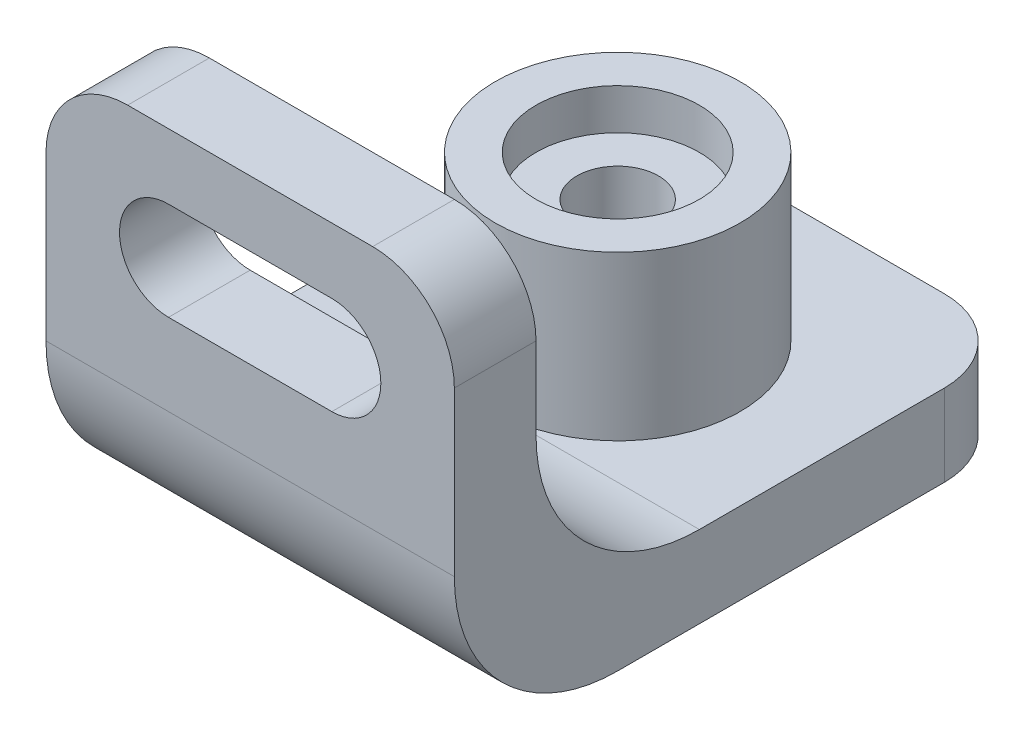
ISO-10303-21;
HEADER;
FILE_DESCRIPTION(('STEP AP214'),'2;1');
FILE_NAME('part.step','',(''),(''),'','','');
FILE_SCHEMA(('AUTOMOTIVE_DESIGN { 1 0 10303 214 1 1 1 1 }'));
ENDSEC;
DATA;
#1=APPLICATION_CONTEXT('core data for automotive mechanical design processes');
#2=APPLICATION_PROTOCOL_DEFINITION('international standard','automotive_design',2000,#1);
#3=PRODUCT_CONTEXT('',#1,'mechanical');
#4=PRODUCT('Part','Part','',(#3));
#5=PRODUCT_RELATED_PRODUCT_CATEGORY('part','',(#4));
#6=PRODUCT_DEFINITION_FORMATION('','',#4);
#7=PRODUCT_DEFINITION_CONTEXT('part definition',#1,'design');
#8=PRODUCT_DEFINITION('design','',#6,#7);
#9=PRODUCT_DEFINITION_SHAPE('','',#8);
#10=(LENGTH_UNIT() NAMED_UNIT(*) SI_UNIT(.MILLI.,.METRE.));
#11=(NAMED_UNIT(*) PLANE_ANGLE_UNIT() SI_UNIT($,.RADIAN.));
#12=(NAMED_UNIT(*) SI_UNIT($,.STERADIAN.) SOLID_ANGLE_UNIT());
#13=UNCERTAINTY_MEASURE_WITH_UNIT(LENGTH_MEASURE(1.E-05),#10,'distance_accuracy_value','');
#14=(GEOMETRIC_REPRESENTATION_CONTEXT(3) GLOBAL_UNCERTAINTY_ASSIGNED_CONTEXT((#13)) GLOBAL_UNIT_ASSIGNED_CONTEXT((#10,
#11,#12)) REPRESENTATION_CONTEXT('',''));
#15=CARTESIAN_POINT('',(0.,0.,0.));
#16=DIRECTION('',(0.,0.,1.));
#17=DIRECTION('',(1.,0.,0.));
#18=AXIS2_PLACEMENT_3D('',#15,#16,#17);
#19=CARTESIAN_POINT('',(50.,31.6267942583732,33.6842105263158));
#20=DIRECTION('',(0.,-1.,0.));
#21=DIRECTION('',(0.,0.,-1.));
#22=AXIS2_PLACEMENT_3D('',#19,#20,#21);
#23=PLANE('',#22);
#24=DIRECTION('',(-1.,0.,0.));
#25=VECTOR('',#24,1.);
#26=CARTESIAN_POINT('',(50.,31.6267942583732,23.6842105263158));
#27=LINE('',#26,#25);
#28=CARTESIAN_POINT('',(40.,31.6267942583732,23.6842105263158));
#29=VERTEX_POINT('',#28);
#30=CARTESIAN_POINT('',(10.,31.6267942583732,23.6842105263158));
#31=VERTEX_POINT('',#30);
#32=EDGE_CURVE('E281',#29,#31,#27,.T.);
#33=ORIENTED_EDGE('',*,*,#32,.T.);
#34=DIRECTION('',(0.,0.,1.));
#35=VECTOR('',#34,1.);
#36=CARTESIAN_POINT('',(10.,31.6267942583732,33.6842105263158));
#37=LINE('',#36,#35);
#38=CARTESIAN_POINT('',(10.,31.6267942583732,33.6842105263158));
#39=VERTEX_POINT('',#38);
#40=EDGE_CURVE('E212',#31,#39,#37,.T.);
#41=ORIENTED_EDGE('',*,*,#40,.T.);
#42=DIRECTION('',(-1.,0.,0.));
#43=VECTOR('',#42,1.);
#44=CARTESIAN_POINT('',(50.,31.6267942583732,33.6842105263158));
#45=LINE('',#44,#43);
#46=CARTESIAN_POINT('',(40.,31.6267942583732,33.6842105263158));
#47=VERTEX_POINT('',#46);
#48=EDGE_CURVE('E195',#47,#39,#45,.T.);
#49=ORIENTED_EDGE('',*,*,#48,.F.);
#50=DIRECTION('',(0.,0.,1.));
#51=VECTOR('',#50,1.);
#52=CARTESIAN_POINT('',(40.,31.6267942583732,33.6842105263158));
#53=LINE('',#52,#51);
#54=EDGE_CURVE('E206',#47,#29,#53,.F.);
#55=ORIENTED_EDGE('',*,*,#54,.T.);
#56=EDGE_LOOP('',(#33,#41,#49,#55));
#57=FACE_BOUND('',#56,.T.);
#58=ADVANCED_FACE('F39',(#57),#23,.F.);
#59=CARTESIAN_POINT('',(50.,31.6267942583732,33.6842105263158));
#60=DIRECTION('',(0.,0.,-1.));
#61=DIRECTION('',(-1.,0.,0.));
#62=AXIS2_PLACEMENT_3D('',#59,#60,#61);
#63=PLANE('',#62);
#64=DIRECTION('',(-1.,0.,0.));
#65=VECTOR('',#64,1.);
#66=CARTESIAN_POINT('',(35.,11.6267942583732,33.6842105263158));
#67=LINE('',#66,#65);
#68=CARTESIAN_POINT('',(35.,11.6267942583732,33.6842105263158));
#69=VERTEX_POINT('',#68);
#70=CARTESIAN_POINT('',(15.,11.6267942583732,33.6842105263158));
#71=VERTEX_POINT('',#70);
#72=EDGE_CURVE('E339',#69,#71,#67,.T.);
#73=ORIENTED_EDGE('',*,*,#72,.T.);
#74=CARTESIAN_POINT('',(15.,17.6267942583732,33.6842105263158));
#75=DIRECTION('',(0.,0.,-1.));
#76=DIRECTION('',(0.,1.,0.));
#77=AXIS2_PLACEMENT_3D('',#74,#75,#76);
#78=CIRCLE('',#77,6.);
#79=CARTESIAN_POINT('',(15.,23.6267942583732,33.6842105263158));
#80=VERTEX_POINT('',#79);
#81=EDGE_CURVE('E351',#71,#80,#78,.T.);
#82=ORIENTED_EDGE('',*,*,#81,.T.);
#83=DIRECTION('',(1.,0.,0.));
#84=VECTOR('',#83,1.);
#85=CARTESIAN_POINT('',(35.,23.6267942583732,33.6842105263158));
#86=LINE('',#85,#84);
#87=CARTESIAN_POINT('',(35.,23.6267942583732,33.6842105263158));
#88=VERTEX_POINT('',#87);
#89=EDGE_CURVE('E370',#80,#88,#86,.T.);
#90=ORIENTED_EDGE('',*,*,#89,.T.);
#91=CARTESIAN_POINT('',(35.,17.6267942583732,33.6842105263158));
#92=DIRECTION('',(0.,0.,-1.));
#93=DIRECTION('',(0.,1.,0.));
#94=AXIS2_PLACEMENT_3D('',#91,#92,#93);
#95=CIRCLE('',#94,6.);
#96=EDGE_CURVE('E366',#88,#69,#95,.T.);
#97=ORIENTED_EDGE('',*,*,#96,.T.);
#98=EDGE_LOOP('',(#73,#82,#90,#97));
#99=FACE_BOUND('',#98,.T.);
#100=ORIENTED_EDGE('',*,*,#48,.T.);
#101=CARTESIAN_POINT('',(10.,21.6267942583732,33.6842105263158));
#102=DIRECTION('',(0.,0.,-1.));
#103=DIRECTION('',(-1.,0.,0.));
#104=AXIS2_PLACEMENT_3D('',#101,#102,#103);
#105=CIRCLE('',#104,10.);
#106=CARTESIAN_POINT('',(0.,21.6267942583732,33.6842105263158));
#107=VERTEX_POINT('',#106);
#108=EDGE_CURVE('E216',#39,#107,#105,.F.);
#109=ORIENTED_EDGE('',*,*,#108,.T.);
#110=DIRECTION('',(0.,-1.,0.));
#111=VECTOR('',#110,1.);
#112=CARTESIAN_POINT('',(0.,31.6267942583732,33.6842105263158));
#113=LINE('',#112,#111);
#114=CARTESIAN_POINT('',(0.,1.62679425837335,33.6842105263158));
#115=VERTEX_POINT('',#114);
#116=EDGE_CURVE('E282',#107,#115,#113,.T.);
#117=ORIENTED_EDGE('',*,*,#116,.T.);
#118=DIRECTION('',(-1.,0.,0.));
#119=VECTOR('',#118,1.);
#120=CARTESIAN_POINT('',(50.,1.62679425837335,33.6842105263158));
#121=LINE('',#120,#119);
#122=CARTESIAN_POINT('',(50.,1.62679425837335,33.6842105263158));
#123=VERTEX_POINT('',#122);
#124=EDGE_CURVE('E191',#123,#115,#121,.T.);
#125=ORIENTED_EDGE('',*,*,#124,.F.);
#126=DIRECTION('',(0.,-1.,0.));
#127=VECTOR('',#126,1.);
#128=CARTESIAN_POINT('',(50.,31.6267942583732,33.6842105263158));
#129=LINE('',#128,#127);
#130=CARTESIAN_POINT('',(50.,21.6267942583732,33.6842105263158));
#131=VERTEX_POINT('',#130);
#132=EDGE_CURVE('E271',#131,#123,#129,.T.);
#133=ORIENTED_EDGE('',*,*,#132,.F.);
#134=CARTESIAN_POINT('',(40.,21.6267942583732,33.6842105263158));
#135=DIRECTION('',(0.,0.,-1.));
#136=DIRECTION('',(-1.,0.,0.));
#137=AXIS2_PLACEMENT_3D('',#134,#135,#136);
#138=CIRCLE('',#137,10.);
#139=EDGE_CURVE('E203',#131,#47,#138,.F.);
#140=ORIENTED_EDGE('',*,*,#139,.T.);
#141=EDGE_LOOP('',(#100,#109,#117,#125,#133,#140));
#142=FACE_BOUND('',#141,.T.);
#143=ADVANCED_FACE('F330',(#99,#142),#63,.F.);
#144=CARTESIAN_POINT('',(50.,1.6267942583732,13.6842105263158));
#145=DIRECTION('',(-1.,0.,0.));
#146=DIRECTION('',(0.,0.,1.));
#147=AXIS2_PLACEMENT_3D('',#144,#145,#146);
#148=CYLINDRICAL_SURFACE('',#147,20.);
#149=CARTESIAN_POINT('',(0.,1.6267942583732,13.6842105263158));
#150=DIRECTION('',(1.,0.,0.));
#151=DIRECTION('',(0.,0.,1.));
#152=AXIS2_PLACEMENT_3D('',#149,#150,#151);
#153=CIRCLE('',#152,20.);
#154=CARTESIAN_POINT('',(0.,-18.3732057416268,13.6842105263157));
#155=VERTEX_POINT('',#154);
#156=EDGE_CURVE('E285',#115,#155,#153,.T.);
#157=ORIENTED_EDGE('',*,*,#156,.T.);
#158=DIRECTION('',(-1.,0.,0.));
#159=VECTOR('',#158,1.);
#160=CARTESIAN_POINT('',(50.,-18.3732057416268,13.6842105263157));
#161=LINE('',#160,#159);
#162=CARTESIAN_POINT('',(50.,-18.3732057416268,13.6842105263157));
#163=VERTEX_POINT('',#162);
#164=EDGE_CURVE('E187',#163,#155,#161,.T.);
#165=ORIENTED_EDGE('',*,*,#164,.F.);
#166=CARTESIAN_POINT('',(50.,1.6267942583732,13.6842105263158));
#167=DIRECTION('',(1.,0.,0.));
#168=DIRECTION('',(0.,0.,1.));
#169=AXIS2_PLACEMENT_3D('',#166,#167,#168);
#170=CIRCLE('',#169,20.);
#171=EDGE_CURVE('E263',#123,#163,#170,.T.);
#172=ORIENTED_EDGE('',*,*,#171,.F.);
#173=ORIENTED_EDGE('',*,*,#124,.T.);
#174=EDGE_LOOP('',(#157,#165,#172,#173));
#175=FACE_BOUND('',#174,.T.);
#176=ADVANCED_FACE('F438',(#175),#148,.T.);
#177=CARTESIAN_POINT('',(50.,-18.3732057416268,13.6842105263157));
#178=DIRECTION('',(0.,1.,0.));
#179=DIRECTION('',(0.,0.,1.));
#180=AXIS2_PLACEMENT_3D('',#177,#178,#179);
#181=PLANE('',#180);
#182=DIRECTION('',(0.,0.,-1.));
#183=VECTOR('',#182,1.);
#184=CARTESIAN_POINT('',(0.,-18.3732057416268,13.6842105263157));
#185=LINE('',#184,#183);
#186=CARTESIAN_POINT('',(0.,-18.3732057416268,-26.3157894736842));
#187=VERTEX_POINT('',#186);
#188=EDGE_CURVE('E289',#155,#187,#185,.T.);
#189=ORIENTED_EDGE('',*,*,#188,.T.);
#190=CARTESIAN_POINT('',(10.,-18.3732057416268,-26.3157894736842));
#191=DIRECTION('',(0.,1.,0.));
#192=DIRECTION('',(0.,0.,1.));
#193=AXIS2_PLACEMENT_3D('',#190,#191,#192);
#194=CIRCLE('',#193,10.);
#195=CARTESIAN_POINT('',(10.,-18.3732057416268,-36.3157894736842));
#196=VERTEX_POINT('',#195);
#197=EDGE_CURVE('E11',#187,#196,#194,.F.);
#198=ORIENTED_EDGE('',*,*,#197,.T.);
#199=DIRECTION('',(-1.,0.,0.));
#200=VECTOR('',#199,1.);
#201=CARTESIAN_POINT('',(50.,-18.3732057416268,-36.3157894736842));
#202=LINE('',#201,#200);
#203=CARTESIAN_POINT('',(40.,-18.3732057416268,-36.3157894736842));
#204=VERTEX_POINT('',#203);
#205=EDGE_CURVE('E183',#204,#196,#202,.T.);
#206=ORIENTED_EDGE('',*,*,#205,.F.);
#207=CARTESIAN_POINT('',(40.,-18.3732057416268,-26.3157894736842));
#208=DIRECTION('',(0.,1.,0.));
#209=DIRECTION('',(0.,0.,1.));
#210=AXIS2_PLACEMENT_3D('',#207,#208,#209);
#211=CIRCLE('',#210,10.);
#212=CARTESIAN_POINT('',(50.,-18.3732057416268,-26.3157894736842));
#213=VERTEX_POINT('',#212);
#214=EDGE_CURVE('E235',#204,#213,#211,.F.);
#215=ORIENTED_EDGE('',*,*,#214,.T.);
#216=DIRECTION('',(0.,0.,-1.));
#217=VECTOR('',#216,1.);
#218=CARTESIAN_POINT('',(50.,-18.3732057416268,13.6842105263157));
#219=LINE('',#218,#217);
#220=EDGE_CURVE('E261',#163,#213,#219,.T.);
#221=ORIENTED_EDGE('',*,*,#220,.F.);
#222=ORIENTED_EDGE('',*,*,#164,.T.);
#223=EDGE_LOOP('',(#189,#198,#206,#215,#221,#222));
#224=FACE_BOUND('',#223,.T.);
#225=ADVANCED_FACE('F586',(#224),#181,.F.);
#226=CARTESIAN_POINT('',(50.,-8.3732057416268,-36.3157894736842));
#227=DIRECTION('',(0.,0.,1.));
#228=DIRECTION('',(1.,0.,0.));
#229=AXIS2_PLACEMENT_3D('',#226,#227,#228);
#230=PLANE('',#229);
#231=ORIENTED_EDGE('',*,*,#205,.T.);
#232=DIRECTION('',(0.,1.,0.));
#233=VECTOR('',#232,1.);
#234=CARTESIAN_POINT('',(10.,-8.3732057416268,-36.3157894736842));
#235=LINE('',#234,#233);
#236=CARTESIAN_POINT('',(10.,-8.3732057416268,-36.3157894736842));
#237=VERTEX_POINT('',#236);
#238=EDGE_CURVE('E238',#196,#237,#235,.T.);
#239=ORIENTED_EDGE('',*,*,#238,.T.);
#240=DIRECTION('',(-1.,0.,0.));
#241=VECTOR('',#240,1.);
#242=CARTESIAN_POINT('',(50.,-8.3732057416268,-36.3157894736842));
#243=LINE('',#242,#241);
#244=CARTESIAN_POINT('',(40.,-8.3732057416268,-36.3157894736842));
#245=VERTEX_POINT('',#244);
#246=EDGE_CURVE('E166',#245,#237,#243,.T.);
#247=ORIENTED_EDGE('',*,*,#246,.F.);
#248=DIRECTION('',(0.,1.,0.));
#249=VECTOR('',#248,1.);
#250=CARTESIAN_POINT('',(40.,-8.3732057416268,-36.3157894736842));
#251=LINE('',#250,#249);
#252=EDGE_CURVE('E232',#245,#204,#251,.F.);
#253=ORIENTED_EDGE('',*,*,#252,.T.);
#254=EDGE_LOOP('',(#231,#239,#247,#253));
#255=FACE_BOUND('',#254,.T.);
#256=ADVANCED_FACE('F247',(#255),#230,.F.);
#257=CARTESIAN_POINT('',(50.,-8.3732057416268,3.68421052631565));
#258=DIRECTION('',(0.,-1.,0.));
#259=DIRECTION('',(0.,0.,-1.));
#260=AXIS2_PLACEMENT_3D('',#257,#258,#259);
#261=PLANE('',#260);
#262=DIRECTION('',(-1.,0.,0.));
#263=VECTOR('',#262,1.);
#264=CARTESIAN_POINT('',(50.,-8.3732057416268,3.68421052631565));
#265=LINE('',#264,#263);
#266=CARTESIAN_POINT('',(25.,-8.3732057416268,3.68421052631579));
#267=VERTEX_POINT('',#266);
#268=CARTESIAN_POINT('',(0.,-8.3732057416268,3.68421052631565));
#269=VERTEX_POINT('',#268);
#270=EDGE_CURVE('E160',#267,#269,#265,.T.);
#271=ORIENTED_EDGE('',*,*,#270,.F.);
#272=CARTESIAN_POINT('',(25.,-8.3732057416268,-11.3157894736842));
#273=DIRECTION('',(0.,1.,0.));
#274=DIRECTION('',(0.,0.,1.));
#275=AXIS2_PLACEMENT_3D('',#272,#273,#274);
#276=CIRCLE('',#275,15.);
#277=EDGE_CURVE('E170',#267,#267,#276,.T.);
#278=ORIENTED_EDGE('',*,*,#277,.F.);
#279=CARTESIAN_POINT('',(50.,-8.3732057416268,3.68421052631565));
#280=VERTEX_POINT('',#279);
#281=EDGE_CURVE('E156',#280,#267,#265,.T.);
#282=ORIENTED_EDGE('',*,*,#281,.F.);
#283=DIRECTION('',(0.,0.,1.));
#284=VECTOR('',#283,1.);
#285=CARTESIAN_POINT('',(50.,-8.3732057416268,3.68421052631565));
#286=LINE('',#285,#284);
#287=CARTESIAN_POINT('',(50.,-8.3732057416268,-26.3157894736842));
#288=VERTEX_POINT('',#287);
#289=EDGE_CURVE('E252',#288,#280,#286,.T.);
#290=ORIENTED_EDGE('',*,*,#289,.F.);
#291=CARTESIAN_POINT('',(40.,-8.3732057416268,-26.3157894736842));
#292=DIRECTION('',(0.,-1.,0.));
#293=DIRECTION('',(0.,0.,-1.));
#294=AXIS2_PLACEMENT_3D('',#291,#292,#293);
#295=CIRCLE('',#294,10.);
#296=EDGE_CURVE('E229',#288,#245,#295,.F.);
#297=ORIENTED_EDGE('',*,*,#296,.T.);
#298=ORIENTED_EDGE('',*,*,#246,.T.);
#299=CARTESIAN_POINT('',(10.,-8.3732057416268,-26.3157894736842));
#300=DIRECTION('',(0.,-1.,0.));
#301=DIRECTION('',(0.,0.,-1.));
#302=AXIS2_PLACEMENT_3D('',#299,#300,#301);
#303=CIRCLE('',#302,10.);
#304=CARTESIAN_POINT('',(0.,-8.3732057416268,-26.3157894736842));
#305=VERTEX_POINT('',#304);
#306=EDGE_CURVE('E62',#237,#305,#303,.F.);
#307=ORIENTED_EDGE('',*,*,#306,.T.);
#308=DIRECTION('',(0.,0.,1.));
#309=VECTOR('',#308,1.);
#310=CARTESIAN_POINT('',(0.,-8.3732057416268,3.68421052631565));
#311=LINE('',#310,#309);
#312=EDGE_CURVE('E171',#305,#269,#311,.T.);
#313=ORIENTED_EDGE('',*,*,#312,.T.);
#314=EDGE_LOOP('',(#271,#278,#282,#290,#297,#298,#307,#313));
#315=FACE_BOUND('',#314,.T.);
#316=ADVANCED_FACE('F168',(#315),#261,.F.);
#317=CARTESIAN_POINT('',(50.,11.6267942583732,3.68421052631579));
#318=DIRECTION('',(-1.,0.,0.));
#319=DIRECTION('',(0.,0.,1.));
#320=AXIS2_PLACEMENT_3D('',#317,#318,#319);
#321=CYLINDRICAL_SURFACE('',#320,20.);
#322=CARTESIAN_POINT('',(0.,11.6267942583732,3.68421052631579));
#323=DIRECTION('',(-1.,0.,0.));
#324=DIRECTION('',(0.,0.,1.));
#325=AXIS2_PLACEMENT_3D('',#322,#323,#324);
#326=CIRCLE('',#325,20.);
#327=CARTESIAN_POINT('',(0.,11.6267942583732,23.6842105263158));
#328=VERTEX_POINT('',#327);
#329=EDGE_CURVE('E294',#269,#328,#326,.T.);
#330=ORIENTED_EDGE('',*,*,#329,.T.);
#331=DIRECTION('',(-1.,0.,0.));
#332=VECTOR('',#331,1.);
#333=CARTESIAN_POINT('',(50.,11.6267942583732,23.6842105263158));
#334=LINE('',#333,#332);
#335=CARTESIAN_POINT('',(15.,11.6267942583732,23.6842105263158));
#336=VERTEX_POINT('',#335);
#337=EDGE_CURVE('E177',#336,#328,#334,.T.);
#338=ORIENTED_EDGE('',*,*,#337,.F.);
#339=DIRECTION('',(-1.,0.,0.));
#340=VECTOR('',#339,1.);
#341=CARTESIAN_POINT('',(35.,11.6267942583732,23.6842105263158));
#342=LINE('',#341,#340);
#343=CARTESIAN_POINT('',(35.,11.6267942583732,23.6842105263158));
#344=VERTEX_POINT('',#343);
#345=EDGE_CURVE('E347',#344,#336,#342,.T.);
#346=ORIENTED_EDGE('',*,*,#345,.F.);
#347=CARTESIAN_POINT('',(50.,11.6267942583732,23.6842105263158));
#348=VERTEX_POINT('',#347);
#349=EDGE_CURVE('E174',#348,#344,#334,.T.);
#350=ORIENTED_EDGE('',*,*,#349,.F.);
#351=CARTESIAN_POINT('',(50.,11.6267942583732,3.68421052631579));
#352=DIRECTION('',(-1.,0.,0.));
#353=DIRECTION('',(0.,0.,1.));
#354=AXIS2_PLACEMENT_3D('',#351,#352,#353);
#355=CIRCLE('',#354,20.);
#356=EDGE_CURVE('E162',#280,#348,#355,.T.);
#357=ORIENTED_EDGE('',*,*,#356,.F.);
#358=ORIENTED_EDGE('',*,*,#281,.T.);
#359=ORIENTED_EDGE('',*,*,#270,.T.);
#360=EDGE_LOOP('',(#330,#338,#346,#350,#357,#358,#359));
#361=FACE_BOUND('',#360,.T.);
#362=ADVANCED_FACE('F159',(#361),#321,.F.);
#363=CARTESIAN_POINT('',(50.,31.6267942583732,23.6842105263158));
#364=DIRECTION('',(0.,0.,1.));
#365=DIRECTION('',(0.,-1.,0.));
#366=AXIS2_PLACEMENT_3D('',#363,#364,#365);
#367=PLANE('',#366);
#368=DIRECTION('',(0.,1.,0.));
#369=VECTOR('',#368,1.);
#370=CARTESIAN_POINT('',(0.,31.6267942583732,23.6842105263158));
#371=LINE('',#370,#369);
#372=CARTESIAN_POINT('',(0.,21.6267942583732,23.6842105263158));
#373=VERTEX_POINT('',#372);
#374=EDGE_CURVE('E297',#328,#373,#371,.T.);
#375=ORIENTED_EDGE('',*,*,#374,.T.);
#376=CARTESIAN_POINT('',(10.,21.6267942583732,23.6842105263158));
#377=DIRECTION('',(0.,0.,1.));
#378=DIRECTION('',(0.,-1.,0.));
#379=AXIS2_PLACEMENT_3D('',#376,#377,#378);
#380=CIRCLE('',#379,10.);
#381=EDGE_CURVE('E222',#373,#31,#380,.F.);
#382=ORIENTED_EDGE('',*,*,#381,.T.);
#383=ORIENTED_EDGE('',*,*,#32,.F.);
#384=CARTESIAN_POINT('',(40.,21.6267942583732,23.6842105263158));
#385=DIRECTION('',(0.,0.,1.));
#386=DIRECTION('',(0.,-1.,0.));
#387=AXIS2_PLACEMENT_3D('',#384,#385,#386);
#388=CIRCLE('',#387,10.);
#389=CARTESIAN_POINT('',(50.,21.6267942583732,23.6842105263158));
#390=VERTEX_POINT('',#389);
#391=EDGE_CURVE('E209',#29,#390,#388,.F.);
#392=ORIENTED_EDGE('',*,*,#391,.T.);
#393=DIRECTION('',(0.,1.,0.));
#394=VECTOR('',#393,1.);
#395=CARTESIAN_POINT('',(50.,31.6267942583732,23.6842105263158));
#396=LINE('',#395,#394);
#397=EDGE_CURVE('E277',#348,#390,#396,.T.);
#398=ORIENTED_EDGE('',*,*,#397,.F.);
#399=ORIENTED_EDGE('',*,*,#349,.T.);
#400=CARTESIAN_POINT('',(35.,17.6267942583732,23.6842105263158));
#401=DIRECTION('',(0.,0.,-1.));
#402=DIRECTION('',(0.,1.,0.));
#403=AXIS2_PLACEMENT_3D('',#400,#401,#402);
#404=CIRCLE('',#403,6.);
#405=CARTESIAN_POINT('',(35.,23.6267942583732,23.6842105263158));
#406=VERTEX_POINT('',#405);
#407=EDGE_CURVE('E352',#406,#344,#404,.T.);
#408=ORIENTED_EDGE('',*,*,#407,.F.);
#409=DIRECTION('',(1.,0.,0.));
#410=VECTOR('',#409,1.);
#411=CARTESIAN_POINT('',(35.,23.6267942583732,23.6842105263158));
#412=LINE('',#411,#410);
#413=CARTESIAN_POINT('',(15.,23.6267942583732,23.6842105263158));
#414=VERTEX_POINT('',#413);
#415=EDGE_CURVE('E356',#414,#406,#412,.T.);
#416=ORIENTED_EDGE('',*,*,#415,.F.);
#417=CARTESIAN_POINT('',(15.,17.6267942583732,23.6842105263158));
#418=DIRECTION('',(0.,0.,-1.));
#419=DIRECTION('',(0.,1.,0.));
#420=AXIS2_PLACEMENT_3D('',#417,#418,#419);
#421=CIRCLE('',#420,6.);
#422=EDGE_CURVE('E313',#336,#414,#421,.T.);
#423=ORIENTED_EDGE('',*,*,#422,.F.);
#424=ORIENTED_EDGE('',*,*,#337,.T.);
#425=EDGE_LOOP('',(#375,#382,#383,#392,#398,#399,#408,#416,#423,#424));
#426=FACE_BOUND('',#425,.T.);
#427=ADVANCED_FACE('F309',(#426),#367,.F.);
#428=CARTESIAN_POINT('',(50.,11.6267942583732,3.68421052631579));
#429=DIRECTION('',(-1.,0.,0.));
#430=DIRECTION('',(0.,0.,1.));
#431=AXIS2_PLACEMENT_3D('',#428,#429,#430);
#432=PLANE('',#431);
#433=ORIENTED_EDGE('',*,*,#220,.T.);
#434=DIRECTION('',(0.,1.,0.));
#435=VECTOR('',#434,1.);
#436=CARTESIAN_POINT('',(50.,11.6267942583732,-26.3157894736842));
#437=LINE('',#436,#435);
#438=EDGE_CURVE('E225',#213,#288,#437,.T.);
#439=ORIENTED_EDGE('',*,*,#438,.T.);
#440=ORIENTED_EDGE('',*,*,#289,.T.);
#441=ORIENTED_EDGE('',*,*,#356,.T.);
#442=ORIENTED_EDGE('',*,*,#397,.T.);
#443=DIRECTION('',(0.,0.,1.));
#444=VECTOR('',#443,1.);
#445=CARTESIAN_POINT('',(50.,21.6267942583732,3.68421052631579));
#446=LINE('',#445,#444);
#447=EDGE_CURVE('E199',#390,#131,#446,.T.);
#448=ORIENTED_EDGE('',*,*,#447,.T.);
#449=ORIENTED_EDGE('',*,*,#132,.T.);
#450=ORIENTED_EDGE('',*,*,#171,.T.);
#451=EDGE_LOOP('',(#433,#439,#440,#441,#442,#448,#449,#450));
#452=FACE_BOUND('',#451,.T.);
#453=ADVANCED_FACE('F259',(#452),#432,.F.);
#454=CARTESIAN_POINT('',(0.,11.6267942583732,3.68421052631579));
#455=DIRECTION('',(-1.,0.,0.));
#456=DIRECTION('',(0.,0.,1.));
#457=AXIS2_PLACEMENT_3D('',#454,#455,#456);
#458=PLANE('',#457);
#459=ORIENTED_EDGE('',*,*,#312,.F.);
#460=DIRECTION('',(0.,1.,0.));
#461=VECTOR('',#460,1.);
#462=CARTESIAN_POINT('',(0.,-18.3732057416268,-26.3157894736842));
#463=LINE('',#462,#461);
#464=EDGE_CURVE('E48',#305,#187,#463,.F.);
#465=ORIENTED_EDGE('',*,*,#464,.T.);
#466=ORIENTED_EDGE('',*,*,#188,.F.);
#467=ORIENTED_EDGE('',*,*,#156,.F.);
#468=ORIENTED_EDGE('',*,*,#116,.F.);
#469=DIRECTION('',(0.,0.,1.));
#470=VECTOR('',#469,1.);
#471=CARTESIAN_POINT('',(0.,21.6267942583732,23.6842105263158));
#472=LINE('',#471,#470);
#473=EDGE_CURVE('E219',#107,#373,#472,.F.);
#474=ORIENTED_EDGE('',*,*,#473,.T.);
#475=ORIENTED_EDGE('',*,*,#374,.F.);
#476=ORIENTED_EDGE('',*,*,#329,.F.);
#477=EDGE_LOOP('',(#459,#465,#466,#467,#468,#474,#475,#476));
#478=FACE_BOUND('',#477,.T.);
#479=ADVANCED_FACE('F315',(#478),#458,.T.);
#480=CARTESIAN_POINT('',(15.,17.6267942583732,33.6842105263158));
#481=DIRECTION('',(0.,0.,-1.));
#482=DIRECTION('',(0.,1.,0.));
#483=AXIS2_PLACEMENT_3D('',#480,#481,#482);
#484=CYLINDRICAL_SURFACE('',#483,6.);
#485=ORIENTED_EDGE('',*,*,#422,.T.);
#486=DIRECTION('',(0.,0.,-1.));
#487=VECTOR('',#486,1.);
#488=CARTESIAN_POINT('',(15.,23.6267942583732,33.6842105263158));
#489=LINE('',#488,#487);
#490=EDGE_CURVE('E334',#80,#414,#489,.T.);
#491=ORIENTED_EDGE('',*,*,#490,.F.);
#492=ORIENTED_EDGE('',*,*,#81,.F.);
#493=DIRECTION('',(0.,0.,-1.));
#494=VECTOR('',#493,1.);
#495=CARTESIAN_POINT('',(15.,11.6267942583732,33.6842105263158));
#496=LINE('',#495,#494);
#497=EDGE_CURVE('E286',#71,#336,#496,.T.);
#498=ORIENTED_EDGE('',*,*,#497,.T.);
#499=EDGE_LOOP('',(#485,#491,#492,#498));
#500=FACE_BOUND('',#499,.T.);
#501=ADVANCED_FACE('F535',(#500),#484,.F.);
#502=CARTESIAN_POINT('',(35.,11.6267942583732,33.6842105263158));
#503=DIRECTION('',(0.,-1.,0.));
#504=DIRECTION('',(0.,0.,-1.));
#505=AXIS2_PLACEMENT_3D('',#502,#503,#504);
#506=PLANE('',#505);
#507=ORIENTED_EDGE('',*,*,#345,.T.);
#508=ORIENTED_EDGE('',*,*,#497,.F.);
#509=ORIENTED_EDGE('',*,*,#72,.F.);
#510=DIRECTION('',(0.,0.,-1.));
#511=VECTOR('',#510,1.);
#512=CARTESIAN_POINT('',(35.,11.6267942583732,33.6842105263158));
#513=LINE('',#512,#511);
#514=EDGE_CURVE('E342',#69,#344,#513,.T.);
#515=ORIENTED_EDGE('',*,*,#514,.T.);
#516=EDGE_LOOP('',(#507,#508,#509,#515));
#517=FACE_BOUND('',#516,.T.);
#518=ADVANCED_FACE('F540',(#517),#506,.F.);
#519=CARTESIAN_POINT('',(35.,17.6267942583732,33.6842105263158));
#520=DIRECTION('',(0.,0.,-1.));
#521=DIRECTION('',(0.,1.,0.));
#522=AXIS2_PLACEMENT_3D('',#519,#520,#521);
#523=CYLINDRICAL_SURFACE('',#522,6.);
#524=ORIENTED_EDGE('',*,*,#407,.T.);
#525=ORIENTED_EDGE('',*,*,#514,.F.);
#526=ORIENTED_EDGE('',*,*,#96,.F.);
#527=DIRECTION('',(0.,0.,-1.));
#528=VECTOR('',#527,1.);
#529=CARTESIAN_POINT('',(35.,23.6267942583732,33.6842105263158));
#530=LINE('',#529,#528);
#531=EDGE_CURVE('E338',#88,#406,#530,.T.);
#532=ORIENTED_EDGE('',*,*,#531,.T.);
#533=EDGE_LOOP('',(#524,#525,#526,#532));
#534=FACE_BOUND('',#533,.T.);
#535=ADVANCED_FACE('F549',(#534),#523,.F.);
#536=CARTESIAN_POINT('',(35.,23.6267942583732,33.6842105263158));
#537=DIRECTION('',(0.,1.,0.));
#538=DIRECTION('',(0.,0.,1.));
#539=AXIS2_PLACEMENT_3D('',#536,#537,#538);
#540=PLANE('',#539);
#541=ORIENTED_EDGE('',*,*,#415,.T.);
#542=ORIENTED_EDGE('',*,*,#531,.F.);
#543=ORIENTED_EDGE('',*,*,#89,.F.);
#544=ORIENTED_EDGE('',*,*,#490,.T.);
#545=EDGE_LOOP('',(#541,#542,#543,#544));
#546=FACE_BOUND('',#545,.T.);
#547=ADVANCED_FACE('F445',(#546),#540,.F.);
#548=CARTESIAN_POINT('',(40.,21.6267942583732,3.68421052631579));
#549=DIRECTION('',(0.,0.,1.));
#550=DIRECTION('',(1.,0.,0.));
#551=AXIS2_PLACEMENT_3D('',#548,#549,#550);
#552=CYLINDRICAL_SURFACE('',#551,10.);
#553=ORIENTED_EDGE('',*,*,#391,.F.);
#554=ORIENTED_EDGE('',*,*,#54,.F.);
#555=ORIENTED_EDGE('',*,*,#139,.F.);
#556=ORIENTED_EDGE('',*,*,#447,.F.);
#557=EDGE_LOOP('',(#553,#554,#555,#556));
#558=FACE_BOUND('',#557,.T.);
#559=ADVANCED_FACE('F326',(#558),#552,.T.);
#560=CARTESIAN_POINT('',(10.,21.6267942583732,33.6842105263158));
#561=DIRECTION('',(0.,0.,-1.));
#562=DIRECTION('',(-1.,0.,0.));
#563=AXIS2_PLACEMENT_3D('',#560,#561,#562);
#564=CYLINDRICAL_SURFACE('',#563,10.);
#565=ORIENTED_EDGE('',*,*,#381,.F.);
#566=ORIENTED_EDGE('',*,*,#473,.F.);
#567=ORIENTED_EDGE('',*,*,#108,.F.);
#568=ORIENTED_EDGE('',*,*,#40,.F.);
#569=EDGE_LOOP('',(#565,#566,#567,#568));
#570=FACE_BOUND('',#569,.T.);
#571=ADVANCED_FACE('F320',(#570),#564,.T.);
#572=CARTESIAN_POINT('',(40.,11.6267942583732,-26.3157894736842));
#573=DIRECTION('',(0.,1.,0.));
#574=DIRECTION('',(0.,0.,1.));
#575=AXIS2_PLACEMENT_3D('',#572,#573,#574);
#576=CYLINDRICAL_SURFACE('',#575,10.);
#577=ORIENTED_EDGE('',*,*,#214,.F.);
#578=ORIENTED_EDGE('',*,*,#252,.F.);
#579=ORIENTED_EDGE('',*,*,#296,.F.);
#580=ORIENTED_EDGE('',*,*,#438,.F.);
#581=EDGE_LOOP('',(#577,#578,#579,#580));
#582=FACE_BOUND('',#581,.T.);
#583=ADVANCED_FACE('F256',(#582),#576,.T.);
#584=CARTESIAN_POINT('',(10.,-8.3732057416268,-26.3157894736842));
#585=DIRECTION('',(0.,-1.,0.));
#586=DIRECTION('',(0.,0.,-1.));
#587=AXIS2_PLACEMENT_3D('',#584,#585,#586);
#588=CYLINDRICAL_SURFACE('',#587,10.);
#589=ORIENTED_EDGE('',*,*,#197,.F.);
#590=ORIENTED_EDGE('',*,*,#464,.F.);
#591=ORIENTED_EDGE('',*,*,#306,.F.);
#592=ORIENTED_EDGE('',*,*,#238,.F.);
#593=EDGE_LOOP('',(#589,#590,#591,#592));
#594=FACE_BOUND('',#593,.T.);
#595=ADVANCED_FACE('F41',(#594),#588,.T.);
#596=CARTESIAN_POINT('',(25.,11.6267942583732,-11.3157894736842));
#597=DIRECTION('',(0.,-1.,0.));
#598=DIRECTION('',(0.,0.,-1.));
#599=AXIS2_PLACEMENT_3D('',#596,#597,#598);
#600=CYLINDRICAL_SURFACE('',#599,15.);
#601=CARTESIAN_POINT('',(25.,11.6267942583732,-11.3157894736842));
#602=DIRECTION('',(0.,1.,0.));
#603=DIRECTION('',(0.,0.,1.));
#604=AXIS2_PLACEMENT_3D('',#601,#602,#603);
#605=CIRCLE('',#604,15.);
#606=CARTESIAN_POINT('',(25.,11.6267942583732,3.68421052631578));
#607=VERTEX_POINT('',#606);
#608=EDGE_CURVE('E362',#607,#607,#605,.T.);
#609=ORIENTED_EDGE('',*,*,#608,.F.);
#610=EDGE_LOOP('',(#609));
#611=FACE_BOUND('',#610,.T.);
#612=ORIENTED_EDGE('',*,*,#277,.T.);
#613=EDGE_LOOP('',(#612));
#614=FACE_BOUND('',#613,.T.);
#615=ADVANCED_FACE('F422',(#611,#614),#600,.T.);
#616=CARTESIAN_POINT('',(25.,11.6267942583732,-11.3157894736842));
#617=DIRECTION('',(0.,1.,0.));
#618=DIRECTION('',(0.,0.,1.));
#619=AXIS2_PLACEMENT_3D('',#616,#617,#618);
#620=PLANE('',#619);
#621=CARTESIAN_POINT('',(25.,11.6267942583732,-11.3157894736842));
#622=DIRECTION('',(0.,1.,0.));
#623=DIRECTION('',(0.,0.,1.));
#624=AXIS2_PLACEMENT_3D('',#621,#622,#623);
#625=CIRCLE('',#624,10.);
#626=CARTESIAN_POINT('',(25.,11.6267942583732,-1.31578947368421));
#627=VERTEX_POINT('',#626);
#628=EDGE_CURVE('E383',#627,#627,#625,.T.);
#629=ORIENTED_EDGE('',*,*,#628,.F.);
#630=EDGE_LOOP('',(#629));
#631=FACE_BOUND('',#630,.T.);
#632=ORIENTED_EDGE('',*,*,#608,.T.);
#633=EDGE_LOOP('',(#632));
#634=FACE_BOUND('',#633,.T.);
#635=ADVANCED_FACE('F416',(#631,#634),#620,.T.);
#636=CARTESIAN_POINT('',(25.,6.6267942583732,-11.3157894736842));
#637=DIRECTION('',(0.,1.,0.));
#638=DIRECTION('',(0.,0.,1.));
#639=AXIS2_PLACEMENT_3D('',#636,#637,#638);
#640=CYLINDRICAL_SURFACE('',#639,10.);
#641=CARTESIAN_POINT('',(25.,6.6267942583732,-11.3157894736842));
#642=DIRECTION('',(0.,1.,0.));
#643=DIRECTION('',(0.,0.,1.));
#644=AXIS2_PLACEMENT_3D('',#641,#642,#643);
#645=CIRCLE('',#644,10.);
#646=CARTESIAN_POINT('',(25.,6.6267942583732,-1.31578947368421));
#647=VERTEX_POINT('',#646);
#648=EDGE_CURVE('E379',#647,#647,#645,.T.);
#649=ORIENTED_EDGE('',*,*,#648,.F.);
#650=EDGE_LOOP('',(#649));
#651=FACE_BOUND('',#650,.T.);
#652=ORIENTED_EDGE('',*,*,#628,.T.);
#653=EDGE_LOOP('',(#652));
#654=FACE_BOUND('',#653,.T.);
#655=ADVANCED_FACE('F410',(#651,#654),#640,.F.);
#656=CARTESIAN_POINT('',(25.,6.6267942583732,-11.3157894736842));
#657=DIRECTION('',(0.,1.,0.));
#658=DIRECTION('',(0.,0.,1.));
#659=AXIS2_PLACEMENT_3D('',#656,#657,#658);
#660=PLANE('',#659);
#661=CARTESIAN_POINT('',(25.,6.6267942583732,-11.3157894736842));
#662=DIRECTION('',(0.,1.,0.));
#663=DIRECTION('',(0.,0.,1.));
#664=AXIS2_PLACEMENT_3D('',#661,#662,#663);
#665=CIRCLE('',#664,5.);
#666=CARTESIAN_POINT('',(25.,6.6267942583732,-6.31578947368422));
#667=VERTEX_POINT('',#666);
#668=EDGE_CURVE('E391',#667,#667,#665,.T.);
#669=ORIENTED_EDGE('',*,*,#668,.F.);
#670=EDGE_LOOP('',(#669));
#671=FACE_BOUND('',#670,.T.);
#672=ORIENTED_EDGE('',*,*,#648,.T.);
#673=EDGE_LOOP('',(#672));
#674=FACE_BOUND('',#673,.T.);
#675=ADVANCED_FACE('F404',(#671,#674),#660,.T.);
#676=CARTESIAN_POINT('',(25.,-8.3732057416268,-11.3157894736842));
#677=DIRECTION('',(0.,1.,0.));
#678=DIRECTION('',(0.,0.,1.));
#679=AXIS2_PLACEMENT_3D('',#676,#677,#678);
#680=CYLINDRICAL_SURFACE('',#679,5.);
#681=CARTESIAN_POINT('',(25.,-8.3732057416268,-11.3157894736842));
#682=DIRECTION('',(0.,1.,0.));
#683=DIRECTION('',(0.,0.,1.));
#684=AXIS2_PLACEMENT_3D('',#681,#682,#683);
#685=CIRCLE('',#684,5.);
#686=CARTESIAN_POINT('',(25.,-8.3732057416268,-6.31578947368422));
#687=VERTEX_POINT('',#686);
#688=EDGE_CURVE('E387',#687,#687,#685,.T.);
#689=ORIENTED_EDGE('',*,*,#688,.F.);
#690=EDGE_LOOP('',(#689));
#691=FACE_BOUND('',#690,.T.);
#692=ORIENTED_EDGE('',*,*,#668,.T.);
#693=EDGE_LOOP('',(#692));
#694=FACE_BOUND('',#693,.T.);
#695=ADVANCED_FACE('F401',(#691,#694),#680,.F.);
#696=CARTESIAN_POINT('',(25.,-8.3732057416268,-11.3157894736842));
#697=DIRECTION('',(0.,1.,0.));
#698=DIRECTION('',(0.,0.,1.));
#699=AXIS2_PLACEMENT_3D('',#696,#697,#698);
#700=PLANE('',#699);
#701=ORIENTED_EDGE('',*,*,#688,.T.);
#702=EDGE_LOOP('',(#701));
#703=FACE_BOUND('',#702,.T.);
#704=ADVANCED_FACE('F399',(#703),#700,.T.);
#705=CLOSED_SHELL('',(#58,#143,#176,#225,#256,#316,#362,#427,#453,#479,#501,#518,#535,#547,#559,
#571,#583,#595,#615,#635,#655,#675,#695,#704));
#706=MANIFOLD_SOLID_BREP('B2',#705);
#707=ADVANCED_BREP_SHAPE_REPRESENTATION('',(#18,#706),#14);
#708=SHAPE_DEFINITION_REPRESENTATION(#9,#707);
ENDSEC;
END-ISO-10303-21;
